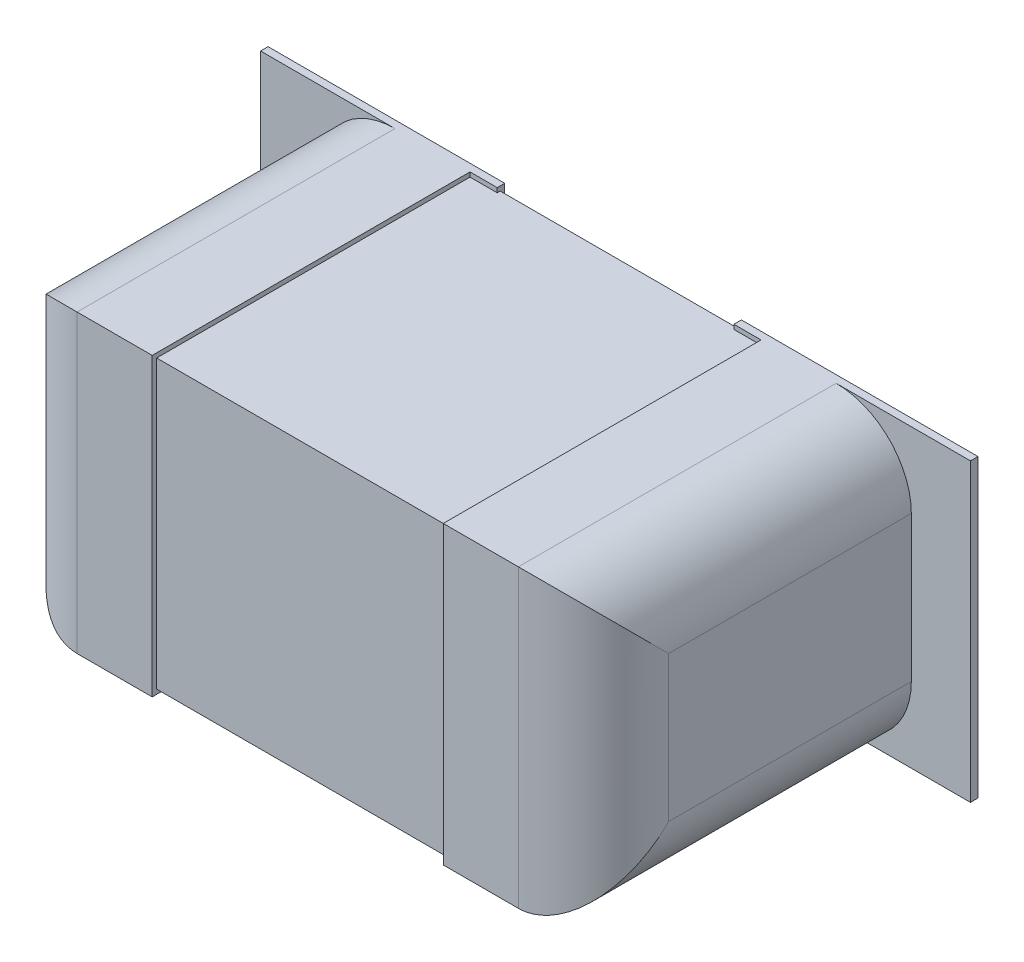
ISO-10303-21;
HEADER;
FILE_DESCRIPTION(('STEP AP214'),'2;1');
FILE_NAME('part.step','',(''),(''),'','','');
FILE_SCHEMA(('AUTOMOTIVE_DESIGN { 1 0 10303 214 1 1 1 1 }'));
ENDSEC;
DATA;
#1=APPLICATION_CONTEXT('core data for automotive mechanical design processes');
#2=APPLICATION_PROTOCOL_DEFINITION('international standard','automotive_design',2000,#1);
#3=PRODUCT_CONTEXT('',#1,'mechanical');
#4=PRODUCT('Part','Part','',(#3));
#5=PRODUCT_RELATED_PRODUCT_CATEGORY('part','',(#4));
#6=PRODUCT_DEFINITION_FORMATION('','',#4);
#7=PRODUCT_DEFINITION_CONTEXT('part definition',#1,'design');
#8=PRODUCT_DEFINITION('design','',#6,#7);
#9=PRODUCT_DEFINITION_SHAPE('','',#8);
#10=(LENGTH_UNIT() NAMED_UNIT(*) SI_UNIT(.MILLI.,.METRE.));
#11=(NAMED_UNIT(*) PLANE_ANGLE_UNIT() SI_UNIT($,.RADIAN.));
#12=(NAMED_UNIT(*) SI_UNIT($,.STERADIAN.) SOLID_ANGLE_UNIT());
#13=UNCERTAINTY_MEASURE_WITH_UNIT(LENGTH_MEASURE(1.E-05),#10,'distance_accuracy_value','');
#14=(GEOMETRIC_REPRESENTATION_CONTEXT(3) GLOBAL_UNCERTAINTY_ASSIGNED_CONTEXT((#13)) GLOBAL_UNIT_ASSIGNED_CONTEXT((#10,
#11,#12)) REPRESENTATION_CONTEXT('',''));
#15=CARTESIAN_POINT('',(0.,0.,0.));
#16=DIRECTION('',(0.,0.,1.));
#17=DIRECTION('',(1.,0.,0.));
#18=AXIS2_PLACEMENT_3D('',#15,#16,#17);
#19=CARTESIAN_POINT('',(0.500000000000032,-0.249999999999991,0.0762));
#20=DIRECTION('',(1.,0.,0.));
#21=DIRECTION('',(0.,0.,-1.));
#22=AXIS2_PLACEMENT_3D('',#19,#20,#21);
#23=PLANE('',#22);
#24=DIRECTION('',(0.,0.,-1.));
#25=VECTOR('',#24,1.);
#26=CARTESIAN_POINT('',(0.500000000000032,-0.122999999999991,0.62831867529435));
#27=LINE('',#26,#25);
#28=CARTESIAN_POINT('',(0.500000000000032,-0.122999999999991,0.0889));
#29=VERTEX_POINT('',#28);
#30=CARTESIAN_POINT('',(0.500000000000032,-0.122999999999991,0.49911));
#31=VERTEX_POINT('',#30);
#32=EDGE_CURVE('E325',#29,#31,#27,.F.);
#33=ORIENTED_EDGE('',*,*,#32,.F.);
#34=DIRECTION('',(0.,1.,0.));
#35=VECTOR('',#34,1.);
#36=CARTESIAN_POINT('',(0.500000000000032,0.,0.0889));
#37=LINE('',#36,#35);
#38=CARTESIAN_POINT('',(0.500000000000032,0.122999999999991,0.0889));
#39=VERTEX_POINT('',#38);
#40=EDGE_CURVE('E238',#39,#29,#37,.F.);
#41=ORIENTED_EDGE('',*,*,#40,.F.);
#42=DIRECTION('',(0.,0.,-1.));
#43=VECTOR('',#42,1.);
#44=CARTESIAN_POINT('',(0.500000000000032,0.122999999999991,0.62831867529435));
#45=LINE('',#44,#43);
#46=CARTESIAN_POINT('',(0.500000000000032,0.122999999999991,0.49911));
#47=VERTEX_POINT('',#46);
#48=EDGE_CURVE('E227',#47,#39,#45,.T.);
#49=ORIENTED_EDGE('',*,*,#48,.F.);
#50=DIRECTION('',(0.,1.,0.));
#51=VECTOR('',#50,1.);
#52=CARTESIAN_POINT('',(0.500000000000032,-0.252128560001866,0.49911));
#53=LINE('',#52,#51);
#54=EDGE_CURVE('E224',#31,#47,#53,.T.);
#55=ORIENTED_EDGE('',*,*,#54,.F.);
#56=EDGE_LOOP('',(#33,#41,#49,#55));
#57=FACE_BOUND('',#56,.T.);
#58=ADVANCED_FACE('F17',(#57),#23,.T.);
#59=CARTESIAN_POINT('',(-0.500000000000032,0.249999999999991,0.0762));
#60=DIRECTION('',(-1.,0.,0.));
#61=DIRECTION('',(0.,0.,1.));
#62=AXIS2_PLACEMENT_3D('',#59,#60,#61);
#63=PLANE('',#62);
#64=DIRECTION('',(0.,0.,-1.));
#65=VECTOR('',#64,1.);
#66=CARTESIAN_POINT('',(-0.500000000000032,0.122999999999991,0.62831867529435));
#67=LINE('',#66,#65);
#68=CARTESIAN_POINT('',(-0.500000000000032,0.122999999999991,0.0889));
#69=VERTEX_POINT('',#68);
#70=CARTESIAN_POINT('',(-0.500000000000032,0.122999999999991,0.49911));
#71=VERTEX_POINT('',#70);
#72=EDGE_CURVE('E309',#69,#71,#67,.F.);
#73=ORIENTED_EDGE('',*,*,#72,.F.);
#74=DIRECTION('',(0.,1.,0.));
#75=VECTOR('',#74,1.);
#76=CARTESIAN_POINT('',(-0.500000000000032,0.,0.0889));
#77=LINE('',#76,#75);
#78=CARTESIAN_POINT('',(-0.500000000000032,-0.122999999999991,0.0889));
#79=VERTEX_POINT('',#78);
#80=EDGE_CURVE('E313',#79,#69,#77,.T.);
#81=ORIENTED_EDGE('',*,*,#80,.F.);
#82=DIRECTION('',(0.,0.,-1.));
#83=VECTOR('',#82,1.);
#84=CARTESIAN_POINT('',(-0.500000000000032,-0.122999999999991,0.62831867529435));
#85=LINE('',#84,#83);
#86=CARTESIAN_POINT('',(-0.500000000000032,-0.122999999999991,0.49911));
#87=VERTEX_POINT('',#86);
#88=EDGE_CURVE('E316',#87,#79,#85,.T.);
#89=ORIENTED_EDGE('',*,*,#88,.F.);
#90=DIRECTION('',(0.,-1.,0.));
#91=VECTOR('',#90,1.);
#92=CARTESIAN_POINT('',(-0.500000000000032,0.252170396105977,0.49911));
#93=LINE('',#92,#91);
#94=EDGE_CURVE('E243',#71,#87,#93,.T.);
#95=ORIENTED_EDGE('',*,*,#94,.F.);
#96=EDGE_LOOP('',(#73,#81,#89,#95));
#97=FACE_BOUND('',#96,.T.);
#98=ADVANCED_FACE('F356',(#97),#63,.T.);
#99=CARTESIAN_POINT('',(-0.373000000000032,0.252170396105977,0.49911));
#100=DIRECTION('',(0.,-1.,0.));
#101=DIRECTION('',(0.,0.,-1.));
#102=AXIS2_PLACEMENT_3D('',#99,#100,#101);
#103=CYLINDRICAL_SURFACE('',#102,0.127);
#104=CARTESIAN_POINT('',(-0.373000000000032,-0.122999999999991,0.49911));
#105=DIRECTION('',(0.,-0.707106781186547,-0.707106781186547));
#106=DIRECTION('',(0.,0.707106781186547,-0.707106781186547));
#107=AXIS2_PLACEMENT_3D('',#104,#105,#106);
#108=ELLIPSE('',#107,0.179605122421383,0.127);
#109=CARTESIAN_POINT('',(-0.373000000000032,-0.249999999999991,0.62611));
#110=VERTEX_POINT('',#109);
#111=EDGE_CURVE('E317',#110,#87,#108,.T.);
#112=ORIENTED_EDGE('',*,*,#111,.F.);
#113=DIRECTION('',(0.,1.,0.));
#114=VECTOR('',#113,1.);
#115=CARTESIAN_POINT('',(-0.373000000000032,0.,0.62611));
#116=LINE('',#115,#114);
#117=CARTESIAN_POINT('',(-0.373000000000032,0.249999999999991,0.62611));
#118=VERTEX_POINT('',#117);
#119=EDGE_CURVE('E208',#118,#110,#116,.F.);
#120=ORIENTED_EDGE('',*,*,#119,.F.);
#121=CARTESIAN_POINT('',(-0.373000000000032,0.122999999999991,0.49911));
#122=DIRECTION('',(0.,0.707106781186547,-0.707106781186547));
#123=DIRECTION('',(0.,-0.707106781186547,-0.707106781186547));
#124=AXIS2_PLACEMENT_3D('',#121,#122,#123);
#125=ELLIPSE('',#124,0.179605122421383,0.127);
#126=EDGE_CURVE('E307',#71,#118,#125,.T.);
#127=ORIENTED_EDGE('',*,*,#126,.F.);
#128=ORIENTED_EDGE('',*,*,#94,.T.);
#129=EDGE_LOOP('',(#112,#120,#127,#128));
#130=FACE_BOUND('',#129,.T.);
#131=ADVANCED_FACE('F361',(#130),#103,.T.);
#132=CARTESIAN_POINT('',(0.373000000000032,-0.252128560001866,0.49911));
#133=DIRECTION('',(0.,1.,0.));
#134=DIRECTION('',(0.,0.,1.));
#135=AXIS2_PLACEMENT_3D('',#132,#133,#134);
#136=CYLINDRICAL_SURFACE('',#135,0.127);
#137=CARTESIAN_POINT('',(0.373000000000032,-0.122999999999991,0.49911));
#138=DIRECTION('',(0.,-0.707106781186547,-0.707106781186547));
#139=DIRECTION('',(0.,0.707106781186547,-0.707106781186547));
#140=AXIS2_PLACEMENT_3D('',#137,#138,#139);
#141=ELLIPSE('',#140,0.179605122421383,0.127);
#142=CARTESIAN_POINT('',(0.373000000000032,-0.249999999999991,0.62611));
#143=VERTEX_POINT('',#142);
#144=EDGE_CURVE('E323',#31,#143,#141,.T.);
#145=ORIENTED_EDGE('',*,*,#144,.F.);
#146=ORIENTED_EDGE('',*,*,#54,.T.);
#147=CARTESIAN_POINT('',(0.373000000000032,0.122999999999991,0.49911));
#148=DIRECTION('',(0.,0.707106781186547,-0.707106781186547));
#149=DIRECTION('',(0.,-0.707106781186547,-0.707106781186547));
#150=AXIS2_PLACEMENT_3D('',#147,#148,#149);
#151=ELLIPSE('',#150,0.179605122421383,0.127);
#152=CARTESIAN_POINT('',(0.373000000000032,0.249999999999991,0.62611));
#153=VERTEX_POINT('',#152);
#154=EDGE_CURVE('E20',#153,#47,#151,.T.);
#155=ORIENTED_EDGE('',*,*,#154,.F.);
#156=DIRECTION('',(0.,1.,0.));
#157=VECTOR('',#156,1.);
#158=CARTESIAN_POINT('',(0.373000000000032,0.,0.62611));
#159=LINE('',#158,#157);
#160=EDGE_CURVE('E198',#143,#153,#159,.T.);
#161=ORIENTED_EDGE('',*,*,#160,.F.);
#162=EDGE_LOOP('',(#145,#146,#155,#161));
#163=FACE_BOUND('',#162,.T.);
#164=ADVANCED_FACE('F222',(#163),#136,.T.);
#165=CARTESIAN_POINT('',(0.373000000000032,0.122999999999991,0.62831867529435));
#166=DIRECTION('',(0.,0.,-1.));
#167=DIRECTION('',(-1.,0.,0.));
#168=AXIS2_PLACEMENT_3D('',#165,#166,#167);
#169=CYLINDRICAL_SURFACE('',#168,0.127);
#170=ORIENTED_EDGE('',*,*,#48,.T.);
#171=CARTESIAN_POINT('',(0.373000000000032,0.122999999999991,0.0888999999999999));
#172=DIRECTION('',(0.,0.,-1.));
#173=DIRECTION('',(-1.,0.,0.));
#174=AXIS2_PLACEMENT_3D('',#171,#172,#173);
#175=CIRCLE('',#174,0.127);
#176=CARTESIAN_POINT('',(0.372860566844937,0.249999999999991,0.0889000180949765));
#177=VERTEX_POINT('',#176);
#178=EDGE_CURVE('E230',#177,#39,#175,.T.);
#179=ORIENTED_EDGE('',*,*,#178,.F.);
#180=DIRECTION('',(-0.000259550557687787,0.,-0.999999966316753));
#181=VECTOR('',#180,1.);
#182=CARTESIAN_POINT('',(0.373000000000032,0.249999999999991,0.62611));
#183=LINE('',#182,#181);
#184=EDGE_CURVE('E215',#153,#177,#183,.T.);
#185=ORIENTED_EDGE('',*,*,#184,.F.);
#186=ORIENTED_EDGE('',*,*,#154,.T.);
#187=EDGE_LOOP('',(#170,#179,#185,#186));
#188=FACE_BOUND('',#187,.T.);
#189=ADVANCED_FACE('F228',(#188),#169,.T.);
#190=CARTESIAN_POINT('',(0.5999988,-0.2500122,0.0762));
#191=DIRECTION('',(1.,0.,0.));
#192=DIRECTION('',(0.,0.,-1.));
#193=AXIS2_PLACEMENT_3D('',#190,#191,#192);
#194=PLANE('',#193);
#195=DIRECTION('',(0.,0.,-1.));
#196=VECTOR('',#195,1.);
#197=CARTESIAN_POINT('',(0.5999988,-0.249999999999991,0.0762));
#198=LINE('',#197,#196);
#199=CARTESIAN_POINT('',(0.5999988,-0.249999999999991,0.0762));
#200=VERTEX_POINT('',#199);
#201=CARTESIAN_POINT('',(0.5999988,-0.249999999999991,0.0889));
#202=VERTEX_POINT('',#201);
#203=EDGE_CURVE('E295',#200,#202,#198,.F.);
#204=ORIENTED_EDGE('',*,*,#203,.F.);
#205=DIRECTION('',(0.,1.,0.));
#206=VECTOR('',#205,1.);
#207=CARTESIAN_POINT('',(0.5999988,0.,0.0762));
#208=LINE('',#207,#206);
#209=CARTESIAN_POINT('',(0.5999988,0.249999999999991,0.0762));
#210=VERTEX_POINT('',#209);
#211=EDGE_CURVE('E298',#200,#210,#208,.T.);
#212=ORIENTED_EDGE('',*,*,#211,.T.);
#213=DIRECTION('',(0.,0.,1.));
#214=VECTOR('',#213,1.);
#215=CARTESIAN_POINT('',(0.5999988,0.249999999999991,0.0762));
#216=LINE('',#215,#214);
#217=CARTESIAN_POINT('',(0.5999988,0.249999999999991,0.0889));
#218=VERTEX_POINT('',#217);
#219=EDGE_CURVE('E234',#218,#210,#216,.F.);
#220=ORIENTED_EDGE('',*,*,#219,.F.);
#221=DIRECTION('',(0.,1.,0.));
#222=VECTOR('',#221,1.);
#223=CARTESIAN_POINT('',(0.5999988,0.,0.0889));
#224=LINE('',#223,#222);
#225=EDGE_CURVE('E241',#202,#218,#224,.T.);
#226=ORIENTED_EDGE('',*,*,#225,.F.);
#227=EDGE_LOOP('',(#204,#212,#220,#226));
#228=FACE_BOUND('',#227,.T.);
#229=ADVANCED_FACE('F336',(#228),#194,.T.);
#230=CARTESIAN_POINT('',(0.,0.,0.0889));
#231=DIRECTION('',(0.,0.,1.));
#232=DIRECTION('',(1.,0.,0.));
#233=AXIS2_PLACEMENT_3D('',#230,#231,#232);
#234=PLANE('',#233);
#235=ORIENTED_EDGE('',*,*,#178,.T.);
#236=ORIENTED_EDGE('',*,*,#40,.T.);
#237=CARTESIAN_POINT('',(0.373000000000032,-0.122999999999991,0.0888999999999999));
#238=DIRECTION('',(0.,0.,-1.));
#239=DIRECTION('',(-1.,0.,0.));
#240=AXIS2_PLACEMENT_3D('',#237,#238,#239);
#241=CIRCLE('',#240,0.127);
#242=CARTESIAN_POINT('',(0.372860566844937,-0.249999999999991,0.0889000180949766));
#243=VERTEX_POINT('',#242);
#244=EDGE_CURVE('E320',#243,#29,#241,.F.);
#245=ORIENTED_EDGE('',*,*,#244,.F.);
#246=DIRECTION('',(1.,0.,0.));
#247=VECTOR('',#246,1.);
#248=CARTESIAN_POINT('',(-0.500000000000032,-0.249999999999991,0.0889));
#249=LINE('',#248,#247);
#250=EDGE_CURVE('E297',#202,#243,#249,.F.);
#251=ORIENTED_EDGE('',*,*,#250,.F.);
#252=ORIENTED_EDGE('',*,*,#225,.T.);
#253=DIRECTION('',(1.,0.,0.));
#254=VECTOR('',#253,1.);
#255=CARTESIAN_POINT('',(0.500000000000032,0.249999999999991,0.0889));
#256=LINE('',#255,#254);
#257=EDGE_CURVE('E232',#177,#218,#256,.T.);
#258=ORIENTED_EDGE('',*,*,#257,.F.);
#259=EDGE_LOOP('',(#235,#236,#245,#251,#252,#258));
#260=FACE_BOUND('',#259,.T.);
#261=ADVANCED_FACE('F329',(#260),#234,.T.);
#262=CARTESIAN_POINT('',(0.373000000000032,-0.122999999999991,0.62831867529435));
#263=DIRECTION('',(0.,0.,-1.));
#264=DIRECTION('',(-1.,0.,0.));
#265=AXIS2_PLACEMENT_3D('',#262,#263,#264);
#266=CYLINDRICAL_SURFACE('',#265,0.127);
#267=DIRECTION('',(0.000259550557687787,0.,0.999999966316753));
#268=VECTOR('',#267,1.);
#269=CARTESIAN_POINT('',(0.37286056684024,-0.249999999999991,0.0889));
#270=LINE('',#269,#268);
#271=EDGE_CURVE('E343',#243,#143,#270,.T.);
#272=ORIENTED_EDGE('',*,*,#271,.F.);
#273=ORIENTED_EDGE('',*,*,#244,.T.);
#274=ORIENTED_EDGE('',*,*,#32,.T.);
#275=ORIENTED_EDGE('',*,*,#144,.T.);
#276=EDGE_LOOP('',(#272,#273,#274,#275));
#277=FACE_BOUND('',#276,.T.);
#278=ADVANCED_FACE('F353',(#277),#266,.T.);
#279=CARTESIAN_POINT('',(-0.373000000000032,-0.122999999999991,0.62831867529435));
#280=DIRECTION('',(0.,0.,-1.));
#281=DIRECTION('',(-1.,0.,0.));
#282=AXIS2_PLACEMENT_3D('',#279,#280,#281);
#283=CYLINDRICAL_SURFACE('',#282,0.127);
#284=ORIENTED_EDGE('',*,*,#88,.T.);
#285=CARTESIAN_POINT('',(-0.373000000000032,-0.122999999999991,0.0888999999999999));
#286=DIRECTION('',(0.,0.,-1.));
#287=DIRECTION('',(-1.,0.,0.));
#288=AXIS2_PLACEMENT_3D('',#285,#286,#287);
#289=CIRCLE('',#288,0.127);
#290=CARTESIAN_POINT('',(-0.372860566844937,-0.249999999999991,0.0889000180949765));
#291=VERTEX_POINT('',#290);
#292=EDGE_CURVE('E310',#291,#79,#289,.T.);
#293=ORIENTED_EDGE('',*,*,#292,.F.);
#294=DIRECTION('',(0.000259550557687787,0.,-0.999999966316753));
#295=VECTOR('',#294,1.);
#296=CARTESIAN_POINT('',(-0.373000000000032,-0.249999999999991,0.62611));
#297=LINE('',#296,#295);
#298=EDGE_CURVE('E290',#110,#291,#297,.T.);
#299=ORIENTED_EDGE('',*,*,#298,.F.);
#300=ORIENTED_EDGE('',*,*,#111,.T.);
#301=EDGE_LOOP('',(#284,#293,#299,#300));
#302=FACE_BOUND('',#301,.T.);
#303=ADVANCED_FACE('F450',(#302),#283,.T.);
#304=CARTESIAN_POINT('',(-0.5999988,0.2500122,0.0762));
#305=DIRECTION('',(-1.,0.,0.));
#306=DIRECTION('',(0.,0.,1.));
#307=AXIS2_PLACEMENT_3D('',#304,#305,#306);
#308=PLANE('',#307);
#309=DIRECTION('',(0.,0.,1.));
#310=VECTOR('',#309,1.);
#311=CARTESIAN_POINT('',(-0.5999988,0.249999999999991,0.0762));
#312=LINE('',#311,#310);
#313=CARTESIAN_POINT('',(-0.5999988,0.249999999999991,0.0762));
#314=VERTEX_POINT('',#313);
#315=CARTESIAN_POINT('',(-0.5999988,0.249999999999991,0.0889));
#316=VERTEX_POINT('',#315);
#317=EDGE_CURVE('E278',#314,#316,#312,.T.);
#318=ORIENTED_EDGE('',*,*,#317,.F.);
#319=DIRECTION('',(0.,1.,0.));
#320=VECTOR('',#319,1.);
#321=CARTESIAN_POINT('',(-0.5999988,0.,0.0762));
#322=LINE('',#321,#320);
#323=CARTESIAN_POINT('',(-0.5999988,-0.249999999999991,0.0762));
#324=VERTEX_POINT('',#323);
#325=EDGE_CURVE('E281',#314,#324,#322,.F.);
#326=ORIENTED_EDGE('',*,*,#325,.T.);
#327=DIRECTION('',(0.,0.,-1.));
#328=VECTOR('',#327,1.);
#329=CARTESIAN_POINT('',(-0.5999988,-0.249999999999991,0.0762));
#330=LINE('',#329,#328);
#331=CARTESIAN_POINT('',(-0.5999988,-0.249999999999991,0.0889));
#332=VERTEX_POINT('',#331);
#333=EDGE_CURVE('E285',#332,#324,#330,.T.);
#334=ORIENTED_EDGE('',*,*,#333,.F.);
#335=DIRECTION('',(0.,1.,0.));
#336=VECTOR('',#335,1.);
#337=CARTESIAN_POINT('',(-0.5999988,0.,0.0889));
#338=LINE('',#337,#336);
#339=EDGE_CURVE('E314',#316,#332,#338,.F.);
#340=ORIENTED_EDGE('',*,*,#339,.F.);
#341=EDGE_LOOP('',(#318,#326,#334,#340));
#342=FACE_BOUND('',#341,.T.);
#343=ADVANCED_FACE('F446',(#342),#308,.T.);
#344=CARTESIAN_POINT('',(0.,0.,0.0889));
#345=DIRECTION('',(0.,0.,1.));
#346=DIRECTION('',(1.,0.,0.));
#347=AXIS2_PLACEMENT_3D('',#344,#345,#346);
#348=PLANE('',#347);
#349=ORIENTED_EDGE('',*,*,#292,.T.);
#350=ORIENTED_EDGE('',*,*,#80,.T.);
#351=CARTESIAN_POINT('',(-0.373000000000032,0.122999999999991,0.0888999999999999));
#352=DIRECTION('',(0.,0.,-1.));
#353=DIRECTION('',(-1.,0.,0.));
#354=AXIS2_PLACEMENT_3D('',#351,#352,#353);
#355=CIRCLE('',#354,0.127);
#356=CARTESIAN_POINT('',(-0.372860566844937,0.249999999999991,0.0889000180949766));
#357=VERTEX_POINT('',#356);
#358=EDGE_CURVE('E304',#357,#69,#355,.F.);
#359=ORIENTED_EDGE('',*,*,#358,.F.);
#360=DIRECTION('',(1.,0.,0.));
#361=VECTOR('',#360,1.);
#362=CARTESIAN_POINT('',(0.500000000000032,0.249999999999991,0.0889));
#363=LINE('',#362,#361);
#364=EDGE_CURVE('E280',#316,#357,#363,.T.);
#365=ORIENTED_EDGE('',*,*,#364,.F.);
#366=ORIENTED_EDGE('',*,*,#339,.T.);
#367=DIRECTION('',(1.,0.,0.));
#368=VECTOR('',#367,1.);
#369=CARTESIAN_POINT('',(-0.500000000000032,-0.249999999999991,0.0889));
#370=LINE('',#369,#368);
#371=EDGE_CURVE('E287',#291,#332,#370,.F.);
#372=ORIENTED_EDGE('',*,*,#371,.F.);
#373=EDGE_LOOP('',(#349,#350,#359,#365,#366,#372));
#374=FACE_BOUND('',#373,.T.);
#375=ADVANCED_FACE('F442',(#374),#348,.T.);
#376=CARTESIAN_POINT('',(-0.373000000000032,0.122999999999991,0.62831867529435));
#377=DIRECTION('',(0.,0.,-1.));
#378=DIRECTION('',(-1.,0.,0.));
#379=AXIS2_PLACEMENT_3D('',#376,#377,#378);
#380=CYLINDRICAL_SURFACE('',#379,0.127);
#381=DIRECTION('',(-0.000259550557687787,0.,0.999999966316753));
#382=VECTOR('',#381,1.);
#383=CARTESIAN_POINT('',(-0.37286056684024,0.249999999999991,0.0889));
#384=LINE('',#383,#382);
#385=EDGE_CURVE('E483',#357,#118,#384,.T.);
#386=ORIENTED_EDGE('',*,*,#385,.F.);
#387=ORIENTED_EDGE('',*,*,#358,.T.);
#388=ORIENTED_EDGE('',*,*,#72,.T.);
#389=ORIENTED_EDGE('',*,*,#126,.T.);
#390=EDGE_LOOP('',(#386,#387,#388,#389));
#391=FACE_BOUND('',#390,.T.);
#392=ADVANCED_FACE('F438',(#391),#380,.T.);
#393=CARTESIAN_POINT('',(0.,0.,0.62611));
#394=DIRECTION('',(0.,0.,1.));
#395=DIRECTION('',(1.,0.,0.));
#396=AXIS2_PLACEMENT_3D('',#393,#394,#395);
#397=PLANE('',#396);
#398=DIRECTION('',(1.,0.,0.));
#399=VECTOR('',#398,1.);
#400=CARTESIAN_POINT('',(0.500000000000032,0.249999999999991,0.62611));
#401=LINE('',#400,#399);
#402=CARTESIAN_POINT('',(-0.246000000000007,0.249999999999991,0.62611));
#403=VERTEX_POINT('',#402);
#404=EDGE_CURVE('E277',#118,#403,#401,.T.);
#405=ORIENTED_EDGE('',*,*,#404,.F.);
#406=ORIENTED_EDGE('',*,*,#119,.T.);
#407=DIRECTION('',(1.,0.,0.));
#408=VECTOR('',#407,1.);
#409=CARTESIAN_POINT('',(-0.500000000000032,-0.249999999999991,0.62611));
#410=LINE('',#409,#408);
#411=CARTESIAN_POINT('',(-0.246000000000007,-0.250002711111104,0.62611));
#412=VERTEX_POINT('',#411);
#413=EDGE_CURVE('E294',#412,#110,#410,.F.);
#414=ORIENTED_EDGE('',*,*,#413,.F.);
#415=DIRECTION('',(0.,1.,0.));
#416=VECTOR('',#415,1.);
#417=CARTESIAN_POINT('',(-0.246000000000007,-0.249999999999991,0.62611));
#418=LINE('',#417,#416);
#419=EDGE_CURVE('E514',#412,#403,#418,.T.);
#420=ORIENTED_EDGE('',*,*,#419,.T.);
#421=EDGE_LOOP('',(#405,#406,#414,#420));
#422=FACE_BOUND('',#421,.T.);
#423=ADVANCED_FACE('F435',(#422),#397,.T.);
#424=CARTESIAN_POINT('',(0.,0.,0.62611));
#425=DIRECTION('',(0.,0.,1.));
#426=DIRECTION('',(1.,0.,0.));
#427=AXIS2_PLACEMENT_3D('',#424,#425,#426);
#428=PLANE('',#427);
#429=DIRECTION('',(1.,0.,0.));
#430=VECTOR('',#429,1.);
#431=CARTESIAN_POINT('',(-0.500000000000032,-0.249999999999991,0.62611));
#432=LINE('',#431,#430);
#433=CARTESIAN_POINT('',(0.246000000000007,-0.249999999999991,0.62611));
#434=VERTEX_POINT('',#433);
#435=EDGE_CURVE('E204',#143,#434,#432,.F.);
#436=ORIENTED_EDGE('',*,*,#435,.F.);
#437=ORIENTED_EDGE('',*,*,#160,.T.);
#438=DIRECTION('',(1.,0.,0.));
#439=VECTOR('',#438,1.);
#440=CARTESIAN_POINT('',(0.500000000000032,0.249999999999991,0.62611));
#441=LINE('',#440,#439);
#442=CARTESIAN_POINT('',(0.246000000000007,0.250002711111104,0.62611));
#443=VERTEX_POINT('',#442);
#444=EDGE_CURVE('E202',#443,#153,#441,.T.);
#445=ORIENTED_EDGE('',*,*,#444,.F.);
#446=DIRECTION('',(0.,1.,0.));
#447=VECTOR('',#446,1.);
#448=CARTESIAN_POINT('',(0.246000000000007,-0.249999999999991,0.62611));
#449=LINE('',#448,#447);
#450=EDGE_CURVE('E569',#443,#434,#449,.F.);
#451=ORIENTED_EDGE('',*,*,#450,.T.);
#452=EDGE_LOOP('',(#436,#437,#445,#451));
#453=FACE_BOUND('',#452,.T.);
#454=ADVANCED_FACE('F200',(#453),#428,.T.);
#455=CARTESIAN_POINT('',(0.,0.,0.0889));
#456=DIRECTION('',(0.,0.,1.));
#457=DIRECTION('',(1.,0.,0.));
#458=AXIS2_PLACEMENT_3D('',#455,#456,#457);
#459=PLANE('',#458);
#460=DIRECTION('',(1.,0.,0.));
#461=VECTOR('',#460,1.);
#462=CARTESIAN_POINT('',(-0.246000000000007,0.242379999999991,0.0889));
#463=LINE('',#462,#461);
#464=CARTESIAN_POINT('',(0.1999996,0.242379999999991,0.0889));
#465=VERTEX_POINT('',#464);
#466=CARTESIAN_POINT('',(0.246000000000007,0.242379999999991,0.0889));
#467=VERTEX_POINT('',#466);
#468=EDGE_CURVE('E530',#465,#467,#463,.T.);
#469=ORIENTED_EDGE('',*,*,#468,.T.);
#470=DIRECTION('',(0.,1.,0.));
#471=VECTOR('',#470,1.);
#472=CARTESIAN_POINT('',(0.246000000000007,-0.249999999999991,0.0889));
#473=LINE('',#472,#471);
#474=CARTESIAN_POINT('',(0.246000000000007,0.250002033333325,0.0889));
#475=VERTEX_POINT('',#474);
#476=EDGE_CURVE('E559',#467,#475,#473,.T.);
#477=ORIENTED_EDGE('',*,*,#476,.T.);
#478=DIRECTION('',(1.,0.,0.));
#479=VECTOR('',#478,1.);
#480=CARTESIAN_POINT('',(0.500000000000032,0.249999999999991,0.0889));
#481=LINE('',#480,#479);
#482=CARTESIAN_POINT('',(0.1999996,0.249999999999991,0.0889));
#483=VERTEX_POINT('',#482);
#484=EDGE_CURVE('E302',#483,#475,#481,.T.);
#485=ORIENTED_EDGE('',*,*,#484,.F.);
#486=DIRECTION('',(0.,1.,0.));
#487=VECTOR('',#486,1.);
#488=CARTESIAN_POINT('',(0.1999996,0.2500122,0.0889));
#489=LINE('',#488,#487);
#490=EDGE_CURVE('E258',#465,#483,#489,.T.);
#491=ORIENTED_EDGE('',*,*,#490,.F.);
#492=EDGE_LOOP('',(#469,#477,#485,#491));
#493=FACE_BOUND('',#492,.T.);
#494=ADVANCED_FACE('F429',(#493),#459,.T.);
#495=CARTESIAN_POINT('',(0.500000000000032,0.249999999999991,0.0762));
#496=DIRECTION('',(0.,1.,0.));
#497=DIRECTION('',(0.,0.,1.));
#498=AXIS2_PLACEMENT_3D('',#495,#496,#497);
#499=PLANE('',#498);
#500=ORIENTED_EDGE('',*,*,#484,.T.);
#501=DIRECTION('',(0.,0.,-1.));
#502=VECTOR('',#501,1.);
#503=CARTESIAN_POINT('',(0.246000000000007,0.25000406666666,0.08382));
#504=LINE('',#503,#502);
#505=EDGE_CURVE('E218',#475,#443,#504,.F.);
#506=ORIENTED_EDGE('',*,*,#505,.T.);
#507=ORIENTED_EDGE('',*,*,#444,.T.);
#508=ORIENTED_EDGE('',*,*,#184,.T.);
#509=ORIENTED_EDGE('',*,*,#257,.T.);
#510=ORIENTED_EDGE('',*,*,#219,.T.);
#511=DIRECTION('',(1.,0.,0.));
#512=VECTOR('',#511,1.);
#513=CARTESIAN_POINT('',(0.500000000000032,0.249999999999991,0.0762));
#514=LINE('',#513,#512);
#515=CARTESIAN_POINT('',(0.1999996,0.249999999999991,0.0762));
#516=VERTEX_POINT('',#515);
#517=EDGE_CURVE('E299',#210,#516,#514,.F.);
#518=ORIENTED_EDGE('',*,*,#517,.T.);
#519=DIRECTION('',(0.,0.,-1.));
#520=VECTOR('',#519,1.);
#521=CARTESIAN_POINT('',(0.1999996,0.249999999999991,0.0762));
#522=LINE('',#521,#520);
#523=EDGE_CURVE('E256',#483,#516,#522,.T.);
#524=ORIENTED_EDGE('',*,*,#523,.F.);
#525=EDGE_LOOP('',(#500,#506,#507,#508,#509,#510,#518,#524));
#526=FACE_BOUND('',#525,.T.);
#527=ADVANCED_FACE('F212',(#526),#499,.T.);
#528=CARTESIAN_POINT('',(0.,0.,0.0762));
#529=DIRECTION('',(0.,0.,1.));
#530=DIRECTION('',(1.,0.,0.));
#531=AXIS2_PLACEMENT_3D('',#528,#529,#530);
#532=PLANE('',#531);
#533=DIRECTION('',(1.,0.,0.));
#534=VECTOR('',#533,1.);
#535=CARTESIAN_POINT('',(-0.500000000000032,-0.249999999999991,0.0762));
#536=LINE('',#535,#534);
#537=CARTESIAN_POINT('',(0.1999996,-0.249999999999991,0.0762));
#538=VERTEX_POINT('',#537);
#539=EDGE_CURVE('E291',#538,#200,#536,.T.);
#540=ORIENTED_EDGE('',*,*,#539,.F.);
#541=DIRECTION('',(0.,1.,0.));
#542=VECTOR('',#541,1.);
#543=CARTESIAN_POINT('',(0.1999996,0.2500122,0.0762));
#544=LINE('',#543,#542);
#545=EDGE_CURVE('E255',#516,#538,#544,.F.);
#546=ORIENTED_EDGE('',*,*,#545,.F.);
#547=ORIENTED_EDGE('',*,*,#517,.F.);
#548=ORIENTED_EDGE('',*,*,#211,.F.);
#549=EDGE_LOOP('',(#540,#546,#547,#548));
#550=FACE_BOUND('',#549,.T.);
#551=ADVANCED_FACE('F424',(#550),#532,.F.);
#552=CARTESIAN_POINT('',(-0.500000000000032,-0.249999999999991,0.0762));
#553=DIRECTION('',(0.,-1.,0.));
#554=DIRECTION('',(0.,0.,-1.));
#555=AXIS2_PLACEMENT_3D('',#552,#553,#554);
#556=PLANE('',#555);
#557=DIRECTION('',(0.,0.,1.));
#558=VECTOR('',#557,1.);
#559=CARTESIAN_POINT('',(0.1999996,-0.249999999999991,0.0762));
#560=LINE('',#559,#558);
#561=CARTESIAN_POINT('',(0.1999996,-0.249999999999991,0.0889));
#562=VERTEX_POINT('',#561);
#563=EDGE_CURVE('E252',#538,#562,#560,.T.);
#564=ORIENTED_EDGE('',*,*,#563,.F.);
#565=ORIENTED_EDGE('',*,*,#539,.T.);
#566=ORIENTED_EDGE('',*,*,#203,.T.);
#567=ORIENTED_EDGE('',*,*,#250,.T.);
#568=ORIENTED_EDGE('',*,*,#271,.T.);
#569=ORIENTED_EDGE('',*,*,#435,.T.);
#570=DIRECTION('',(0.,0.,-1.));
#571=VECTOR('',#570,1.);
#572=CARTESIAN_POINT('',(0.246000000000007,-0.249999999999991,0.08382));
#573=LINE('',#572,#571);
#574=CARTESIAN_POINT('',(0.246000000000007,-0.249999999999991,0.0889));
#575=VERTEX_POINT('',#574);
#576=EDGE_CURVE('E265',#434,#575,#573,.T.);
#577=ORIENTED_EDGE('',*,*,#576,.T.);
#578=DIRECTION('',(1.,0.,0.));
#579=VECTOR('',#578,1.);
#580=CARTESIAN_POINT('',(0.,-0.249999999999991,0.0889));
#581=LINE('',#580,#579);
#582=EDGE_CURVE('E259',#562,#575,#581,.T.);
#583=ORIENTED_EDGE('',*,*,#582,.F.);
#584=EDGE_LOOP('',(#564,#565,#566,#567,#568,#569,#577,#583));
#585=FACE_BOUND('',#584,.T.);
#586=ADVANCED_FACE('F348',(#585),#556,.T.);
#587=CARTESIAN_POINT('',(-0.500000000000032,-0.249999999999991,0.0762));
#588=DIRECTION('',(0.,-1.,0.));
#589=DIRECTION('',(0.,0.,-1.));
#590=AXIS2_PLACEMENT_3D('',#587,#588,#589);
#591=PLANE('',#590);
#592=DIRECTION('',(1.,0.,0.));
#593=VECTOR('',#592,1.);
#594=CARTESIAN_POINT('',(0.,-0.25000406666666,0.0889));
#595=LINE('',#594,#593);
#596=CARTESIAN_POINT('',(-0.246000000000007,-0.250003388888882,0.0889));
#597=VERTEX_POINT('',#596);
#598=CARTESIAN_POINT('',(-0.1999996,-0.250002033333325,0.0889));
#599=VERTEX_POINT('',#598);
#600=EDGE_CURVE('E507',#597,#599,#595,.T.);
#601=ORIENTED_EDGE('',*,*,#600,.F.);
#602=DIRECTION('',(0.,0.,1.));
#603=VECTOR('',#602,1.);
#604=CARTESIAN_POINT('',(-0.246000000000007,-0.25000406666666,0.0762));
#605=LINE('',#604,#603);
#606=EDGE_CURVE('E506',#597,#412,#605,.T.);
#607=ORIENTED_EDGE('',*,*,#606,.T.);
#608=ORIENTED_EDGE('',*,*,#413,.T.);
#609=ORIENTED_EDGE('',*,*,#298,.T.);
#610=ORIENTED_EDGE('',*,*,#371,.T.);
#611=ORIENTED_EDGE('',*,*,#333,.T.);
#612=DIRECTION('',(1.,0.,0.));
#613=VECTOR('',#612,1.);
#614=CARTESIAN_POINT('',(-0.500000000000032,-0.249999999999991,0.0762));
#615=LINE('',#614,#613);
#616=CARTESIAN_POINT('',(-0.1999996,-0.249999999999991,0.0762));
#617=VERTEX_POINT('',#616);
#618=EDGE_CURVE('E282',#324,#617,#615,.T.);
#619=ORIENTED_EDGE('',*,*,#618,.T.);
#620=DIRECTION('',(0.,0.,-1.));
#621=VECTOR('',#620,1.);
#622=CARTESIAN_POINT('',(-0.1999996,-0.249999999999991,0.0762));
#623=LINE('',#622,#621);
#624=EDGE_CURVE('E249',#599,#617,#623,.T.);
#625=ORIENTED_EDGE('',*,*,#624,.F.);
#626=EDGE_LOOP('',(#601,#607,#608,#609,#610,#611,#619,#625));
#627=FACE_BOUND('',#626,.T.);
#628=ADVANCED_FACE('F417',(#627),#591,.T.);
#629=CARTESIAN_POINT('',(0.,0.,0.0762));
#630=DIRECTION('',(0.,0.,1.));
#631=DIRECTION('',(1.,0.,0.));
#632=AXIS2_PLACEMENT_3D('',#629,#630,#631);
#633=PLANE('',#632);
#634=DIRECTION('',(1.,0.,0.));
#635=VECTOR('',#634,1.);
#636=CARTESIAN_POINT('',(0.500000000000032,0.249999999999991,0.0762));
#637=LINE('',#636,#635);
#638=CARTESIAN_POINT('',(-0.1999996,0.249999999999991,0.0762));
#639=VERTEX_POINT('',#638);
#640=EDGE_CURVE('E274',#639,#314,#637,.F.);
#641=ORIENTED_EDGE('',*,*,#640,.F.);
#642=DIRECTION('',(0.,1.,0.));
#643=VECTOR('',#642,1.);
#644=CARTESIAN_POINT('',(-0.1999996,-0.2500122,0.0762));
#645=LINE('',#644,#643);
#646=EDGE_CURVE('E248',#617,#639,#645,.T.);
#647=ORIENTED_EDGE('',*,*,#646,.F.);
#648=ORIENTED_EDGE('',*,*,#618,.F.);
#649=ORIENTED_EDGE('',*,*,#325,.F.);
#650=EDGE_LOOP('',(#641,#647,#648,#649));
#651=FACE_BOUND('',#650,.T.);
#652=ADVANCED_FACE('F413',(#651),#633,.F.);
#653=CARTESIAN_POINT('',(0.500000000000032,0.249999999999991,0.0762));
#654=DIRECTION('',(0.,1.,0.));
#655=DIRECTION('',(0.,0.,1.));
#656=AXIS2_PLACEMENT_3D('',#653,#654,#655);
#657=PLANE('',#656);
#658=DIRECTION('',(0.,0.,1.));
#659=VECTOR('',#658,1.);
#660=CARTESIAN_POINT('',(-0.1999996,0.249999999999991,0.0762));
#661=LINE('',#660,#659);
#662=CARTESIAN_POINT('',(-0.1999996,0.249999999999991,0.0889));
#663=VERTEX_POINT('',#662);
#664=EDGE_CURVE('E245',#639,#663,#661,.T.);
#665=ORIENTED_EDGE('',*,*,#664,.F.);
#666=ORIENTED_EDGE('',*,*,#640,.T.);
#667=ORIENTED_EDGE('',*,*,#317,.T.);
#668=ORIENTED_EDGE('',*,*,#364,.T.);
#669=ORIENTED_EDGE('',*,*,#385,.T.);
#670=ORIENTED_EDGE('',*,*,#404,.T.);
#671=DIRECTION('',(0.,0.,1.));
#672=VECTOR('',#671,1.);
#673=CARTESIAN_POINT('',(-0.246000000000007,0.249999999999991,0.0762));
#674=LINE('',#673,#672);
#675=CARTESIAN_POINT('',(-0.246000000000007,0.249999999999991,0.0889));
#676=VERTEX_POINT('',#675);
#677=EDGE_CURVE('E270',#403,#676,#674,.F.);
#678=ORIENTED_EDGE('',*,*,#677,.T.);
#679=DIRECTION('',(-1.,0.,0.));
#680=VECTOR('',#679,1.);
#681=CARTESIAN_POINT('',(0.,0.249999999999991,0.0889));
#682=LINE('',#681,#680);
#683=EDGE_CURVE('E271',#663,#676,#682,.T.);
#684=ORIENTED_EDGE('',*,*,#683,.F.);
#685=EDGE_LOOP('',(#665,#666,#667,#668,#669,#670,#678,#684));
#686=FACE_BOUND('',#685,.T.);
#687=ADVANCED_FACE('F409',(#686),#657,.T.);
#688=CARTESIAN_POINT('',(0.,0.,0.0889));
#689=DIRECTION('',(0.,0.,1.));
#690=DIRECTION('',(1.,0.,0.));
#691=AXIS2_PLACEMENT_3D('',#688,#689,#690);
#692=PLANE('',#691);
#693=DIRECTION('',(0.,1.,0.));
#694=VECTOR('',#693,1.);
#695=CARTESIAN_POINT('',(-0.1999996,-0.2500122,0.0889));
#696=LINE('',#695,#694);
#697=CARTESIAN_POINT('',(-0.1999996,0.242379999999991,0.0889));
#698=VERTEX_POINT('',#697);
#699=EDGE_CURVE('E247',#663,#698,#696,.F.);
#700=ORIENTED_EDGE('',*,*,#699,.F.);
#701=ORIENTED_EDGE('',*,*,#683,.T.);
#702=DIRECTION('',(0.,1.,0.));
#703=VECTOR('',#702,1.);
#704=CARTESIAN_POINT('',(-0.246000000000007,0.,0.0889));
#705=LINE('',#704,#703);
#706=CARTESIAN_POINT('',(-0.246000000000007,0.242379999999991,0.0889));
#707=VERTEX_POINT('',#706);
#708=EDGE_CURVE('E266',#676,#707,#705,.F.);
#709=ORIENTED_EDGE('',*,*,#708,.T.);
#710=DIRECTION('',(1.,0.,0.));
#711=VECTOR('',#710,1.);
#712=CARTESIAN_POINT('',(-0.246000000000007,0.242379999999991,0.0889));
#713=LINE('',#712,#711);
#714=EDGE_CURVE('E273',#707,#698,#713,.T.);
#715=ORIENTED_EDGE('',*,*,#714,.T.);
#716=EDGE_LOOP('',(#700,#701,#709,#715));
#717=FACE_BOUND('',#716,.T.);
#718=ADVANCED_FACE('F405',(#717),#692,.T.);
#719=CARTESIAN_POINT('',(-0.246000000000007,0.242379999999991,0.0762));
#720=DIRECTION('',(0.,-1.,0.));
#721=DIRECTION('',(0.,0.,-1.));
#722=AXIS2_PLACEMENT_3D('',#719,#720,#721);
#723=PLANE('',#722);
#724=DIRECTION('',(-1.,0.,0.));
#725=VECTOR('',#724,1.);
#726=CARTESIAN_POINT('',(-0.246000000000007,0.242379999999991,0.61849));
#727=LINE('',#726,#725);
#728=CARTESIAN_POINT('',(-0.246000000000007,0.242379999999991,0.61849));
#729=VERTEX_POINT('',#728);
#730=CARTESIAN_POINT('',(0.246000000000007,0.242379999999991,0.61849));
#731=VERTEX_POINT('',#730);
#732=EDGE_CURVE('E537',#729,#731,#727,.F.);
#733=ORIENTED_EDGE('',*,*,#732,.T.);
#734=DIRECTION('',(0.,0.,-1.));
#735=VECTOR('',#734,1.);
#736=CARTESIAN_POINT('',(0.246000000000007,0.242379999999991,0.08382));
#737=LINE('',#736,#735);
#738=EDGE_CURVE('E554',#731,#467,#737,.T.);
#739=ORIENTED_EDGE('',*,*,#738,.T.);
#740=ORIENTED_EDGE('',*,*,#468,.F.);
#741=DIRECTION('',(0.,0.,1.));
#742=VECTOR('',#741,1.);
#743=CARTESIAN_POINT('',(0.1999996,0.242379999999991,0.0762));
#744=LINE('',#743,#742);
#745=CARTESIAN_POINT('',(0.1999996,0.242379999999991,0.08382));
#746=VERTEX_POINT('',#745);
#747=EDGE_CURVE('E262',#746,#465,#744,.T.);
#748=ORIENTED_EDGE('',*,*,#747,.F.);
#749=DIRECTION('',(1.,0.,0.));
#750=VECTOR('',#749,1.);
#751=CARTESIAN_POINT('',(-0.246000000000007,0.242379999999991,0.08382));
#752=LINE('',#751,#750);
#753=CARTESIAN_POINT('',(-0.1999996,0.242379999999991,0.08382));
#754=VERTEX_POINT('',#753);
#755=EDGE_CURVE('E592',#746,#754,#752,.F.);
#756=ORIENTED_EDGE('',*,*,#755,.T.);
#757=DIRECTION('',(0.,0.,-1.));
#758=VECTOR('',#757,1.);
#759=CARTESIAN_POINT('',(-0.1999996,0.242379999999991,0.0762));
#760=LINE('',#759,#758);
#761=EDGE_CURVE('E492',#698,#754,#760,.T.);
#762=ORIENTED_EDGE('',*,*,#761,.F.);
#763=ORIENTED_EDGE('',*,*,#714,.F.);
#764=DIRECTION('',(0.,0.,1.));
#765=VECTOR('',#764,1.);
#766=CARTESIAN_POINT('',(-0.246000000000007,0.242379999999991,0.0762));
#767=LINE('',#766,#765);
#768=EDGE_CURVE('E269',#707,#729,#767,.T.);
#769=ORIENTED_EDGE('',*,*,#768,.T.);
#770=EDGE_LOOP('',(#733,#739,#740,#748,#756,#762,#763,#769));
#771=FACE_BOUND('',#770,.T.);
#772=ADVANCED_FACE('F401',(#771),#723,.F.);
#773=CARTESIAN_POINT('',(0.,0.,0.0889));
#774=DIRECTION('',(0.,0.,1.));
#775=DIRECTION('',(1.,0.,0.));
#776=AXIS2_PLACEMENT_3D('',#773,#774,#775);
#777=PLANE('',#776);
#778=DIRECTION('',(1.,0.,0.));
#779=VECTOR('',#778,1.);
#780=CARTESIAN_POINT('',(-0.246000000000007,-0.242379999999991,0.0888999999999999));
#781=LINE('',#780,#779);
#782=CARTESIAN_POINT('',(-0.1999996,-0.242379999999991,0.0889));
#783=VERTEX_POINT('',#782);
#784=CARTESIAN_POINT('',(-0.246000000000007,-0.242379999999991,0.0889));
#785=VERTEX_POINT('',#784);
#786=EDGE_CURVE('E500',#783,#785,#781,.F.);
#787=ORIENTED_EDGE('',*,*,#786,.T.);
#788=DIRECTION('',(0.,1.,0.));
#789=VECTOR('',#788,1.);
#790=CARTESIAN_POINT('',(-0.246000000000007,-0.249999999999991,0.0889));
#791=LINE('',#790,#789);
#792=EDGE_CURVE('E503',#785,#597,#791,.F.);
#793=ORIENTED_EDGE('',*,*,#792,.T.);
#794=ORIENTED_EDGE('',*,*,#600,.T.);
#795=DIRECTION('',(0.,1.,0.));
#796=VECTOR('',#795,1.);
#797=CARTESIAN_POINT('',(-0.1999996,-0.2500122,0.0889));
#798=LINE('',#797,#796);
#799=EDGE_CURVE('E251',#783,#599,#798,.F.);
#800=ORIENTED_EDGE('',*,*,#799,.F.);
#801=EDGE_LOOP('',(#787,#793,#794,#800));
#802=FACE_BOUND('',#801,.T.);
#803=ADVANCED_FACE('F397',(#802),#777,.T.);
#804=CARTESIAN_POINT('',(-0.246000000000007,-0.249999999999991,0.0762));
#805=DIRECTION('',(-1.,0.,0.));
#806=DIRECTION('',(0.,0.,1.));
#807=AXIS2_PLACEMENT_3D('',#804,#805,#806);
#808=PLANE('',#807);
#809=DIRECTION('',(0.,1.,0.));
#810=VECTOR('',#809,1.);
#811=CARTESIAN_POINT('',(-0.246000000000007,0.249999999999991,0.61849));
#812=LINE('',#811,#810);
#813=CARTESIAN_POINT('',(-0.246000000000007,-0.242379999999991,0.61849));
#814=VERTEX_POINT('',#813);
#815=EDGE_CURVE('E533',#814,#729,#812,.T.);
#816=ORIENTED_EDGE('',*,*,#815,.T.);
#817=ORIENTED_EDGE('',*,*,#768,.F.);
#818=ORIENTED_EDGE('',*,*,#708,.F.);
#819=ORIENTED_EDGE('',*,*,#677,.F.);
#820=ORIENTED_EDGE('',*,*,#419,.F.);
#821=ORIENTED_EDGE('',*,*,#606,.F.);
#822=ORIENTED_EDGE('',*,*,#792,.F.);
#823=DIRECTION('',(0.,0.,1.));
#824=VECTOR('',#823,1.);
#825=CARTESIAN_POINT('',(-0.246000000000007,-0.242379999999991,0.62611));
#826=LINE('',#825,#824);
#827=EDGE_CURVE('E496',#785,#814,#826,.T.);
#828=ORIENTED_EDGE('',*,*,#827,.T.);
#829=EDGE_LOOP('',(#816,#817,#818,#819,#820,#821,#822,#828));
#830=FACE_BOUND('',#829,.T.);
#831=ADVANCED_FACE('F393',(#830),#808,.F.);
#832=CARTESIAN_POINT('',(-0.246000000000007,0.249999999999991,0.61849));
#833=DIRECTION('',(0.,0.,-1.));
#834=DIRECTION('',(-1.,0.,0.));
#835=AXIS2_PLACEMENT_3D('',#832,#833,#834);
#836=PLANE('',#835);
#837=DIRECTION('',(1.,0.,0.));
#838=VECTOR('',#837,1.);
#839=CARTESIAN_POINT('',(-0.246000000000007,-0.242379999999991,0.61849));
#840=LINE('',#839,#838);
#841=CARTESIAN_POINT('',(0.246000000000007,-0.242379999999991,0.61849));
#842=VERTEX_POINT('',#841);
#843=EDGE_CURVE('E499',#814,#842,#840,.T.);
#844=ORIENTED_EDGE('',*,*,#843,.T.);
#845=DIRECTION('',(0.,1.,0.));
#846=VECTOR('',#845,1.);
#847=CARTESIAN_POINT('',(0.246000000000007,-0.249999999999991,0.61849));
#848=LINE('',#847,#846);
#849=EDGE_CURVE('E536',#842,#731,#848,.T.);
#850=ORIENTED_EDGE('',*,*,#849,.T.);
#851=ORIENTED_EDGE('',*,*,#732,.F.);
#852=ORIENTED_EDGE('',*,*,#815,.F.);
#853=EDGE_LOOP('',(#844,#850,#851,#852));
#854=FACE_BOUND('',#853,.T.);
#855=ADVANCED_FACE('F389',(#854),#836,.F.);
#856=CARTESIAN_POINT('',(0.246000000000007,-0.249999999999991,0.08382));
#857=DIRECTION('',(1.,0.,0.));
#858=DIRECTION('',(0.,0.,-1.));
#859=AXIS2_PLACEMENT_3D('',#856,#857,#858);
#860=PLANE('',#859);
#861=ORIENTED_EDGE('',*,*,#450,.F.);
#862=ORIENTED_EDGE('',*,*,#505,.F.);
#863=ORIENTED_EDGE('',*,*,#476,.F.);
#864=ORIENTED_EDGE('',*,*,#738,.F.);
#865=ORIENTED_EDGE('',*,*,#849,.F.);
#866=DIRECTION('',(0.,0.,1.));
#867=VECTOR('',#866,1.);
#868=CARTESIAN_POINT('',(0.246000000000007,-0.242379999999991,0.62611));
#869=LINE('',#868,#867);
#870=CARTESIAN_POINT('',(0.246000000000007,-0.242379999999991,0.0889));
#871=VERTEX_POINT('',#870);
#872=EDGE_CURVE('E546',#842,#871,#869,.F.);
#873=ORIENTED_EDGE('',*,*,#872,.T.);
#874=DIRECTION('',(0.,1.,0.));
#875=VECTOR('',#874,1.);
#876=CARTESIAN_POINT('',(0.246000000000007,0.,0.0889));
#877=LINE('',#876,#875);
#878=EDGE_CURVE('E263',#575,#871,#877,.T.);
#879=ORIENTED_EDGE('',*,*,#878,.F.);
#880=ORIENTED_EDGE('',*,*,#576,.F.);
#881=EDGE_LOOP('',(#861,#862,#863,#864,#865,#873,#879,#880));
#882=FACE_BOUND('',#881,.T.);
#883=ADVANCED_FACE('F385',(#882),#860,.F.);
#884=CARTESIAN_POINT('',(0.,0.,0.0889));
#885=DIRECTION('',(0.,0.,1.));
#886=DIRECTION('',(1.,0.,0.));
#887=AXIS2_PLACEMENT_3D('',#884,#885,#886);
#888=PLANE('',#887);
#889=DIRECTION('',(0.,1.,0.));
#890=VECTOR('',#889,1.);
#891=CARTESIAN_POINT('',(0.1999996,0.2500122,0.0889));
#892=LINE('',#891,#890);
#893=CARTESIAN_POINT('',(0.1999996,-0.242379999999991,0.0889));
#894=VERTEX_POINT('',#893);
#895=EDGE_CURVE('E254',#562,#894,#892,.T.);
#896=ORIENTED_EDGE('',*,*,#895,.F.);
#897=ORIENTED_EDGE('',*,*,#582,.T.);
#898=ORIENTED_EDGE('',*,*,#878,.T.);
#899=DIRECTION('',(1.,0.,0.));
#900=VECTOR('',#899,1.);
#901=CARTESIAN_POINT('',(-0.246000000000007,-0.242379999999991,0.0888999999999999));
#902=LINE('',#901,#900);
#903=EDGE_CURVE('E583',#871,#894,#902,.F.);
#904=ORIENTED_EDGE('',*,*,#903,.T.);
#905=EDGE_LOOP('',(#896,#897,#898,#904));
#906=FACE_BOUND('',#905,.T.);
#907=ADVANCED_FACE('F381',(#906),#888,.T.);
#908=CARTESIAN_POINT('',(0.1999996,0.2500122,0.0762));
#909=DIRECTION('',(-1.,0.,0.));
#910=DIRECTION('',(0.,0.,1.));
#911=AXIS2_PLACEMENT_3D('',#908,#909,#910);
#912=PLANE('',#911);
#913=DIRECTION('',(0.,0.,1.));
#914=VECTOR('',#913,1.);
#915=CARTESIAN_POINT('',(0.1999996,-0.242379999999991,0.62611));
#916=LINE('',#915,#914);
#917=CARTESIAN_POINT('',(0.1999996,-0.242379999999991,0.08382));
#918=VERTEX_POINT('',#917);
#919=EDGE_CURVE('E586',#894,#918,#916,.F.);
#920=ORIENTED_EDGE('',*,*,#919,.T.);
#921=DIRECTION('',(0.,1.,0.));
#922=VECTOR('',#921,1.);
#923=CARTESIAN_POINT('',(0.1999996,-0.249999999999991,0.08382));
#924=LINE('',#923,#922);
#925=EDGE_CURVE('E589',#918,#746,#924,.T.);
#926=ORIENTED_EDGE('',*,*,#925,.T.);
#927=ORIENTED_EDGE('',*,*,#747,.T.);
#928=ORIENTED_EDGE('',*,*,#490,.T.);
#929=ORIENTED_EDGE('',*,*,#523,.T.);
#930=ORIENTED_EDGE('',*,*,#545,.T.);
#931=ORIENTED_EDGE('',*,*,#563,.T.);
#932=ORIENTED_EDGE('',*,*,#895,.T.);
#933=EDGE_LOOP('',(#920,#926,#927,#928,#929,#930,#931,#932));
#934=FACE_BOUND('',#933,.T.);
#935=ADVANCED_FACE('F377',(#934),#912,.T.);
#936=CARTESIAN_POINT('',(-0.246000000000007,-0.249999999999991,0.08382));
#937=DIRECTION('',(0.,0.,1.));
#938=DIRECTION('',(1.,0.,0.));
#939=AXIS2_PLACEMENT_3D('',#936,#937,#938);
#940=PLANE('',#939);
#941=DIRECTION('',(0.,1.,0.));
#942=VECTOR('',#941,1.);
#943=CARTESIAN_POINT('',(-0.1999996,-0.2500122,0.08382));
#944=LINE('',#943,#942);
#945=CARTESIAN_POINT('',(-0.1999996,-0.242379999999991,0.08382));
#946=VERTEX_POINT('',#945);
#947=EDGE_CURVE('E34',#754,#946,#944,.F.);
#948=ORIENTED_EDGE('',*,*,#947,.F.);
#949=ORIENTED_EDGE('',*,*,#755,.F.);
#950=ORIENTED_EDGE('',*,*,#925,.F.);
#951=DIRECTION('',(1.,0.,0.));
#952=VECTOR('',#951,1.);
#953=CARTESIAN_POINT('',(-0.246000000000007,-0.242379999999991,0.08382));
#954=LINE('',#953,#952);
#955=EDGE_CURVE('E26',#918,#946,#954,.F.);
#956=ORIENTED_EDGE('',*,*,#955,.T.);
#957=EDGE_LOOP('',(#948,#949,#950,#956));
#958=FACE_BOUND('',#957,.T.);
#959=ADVANCED_FACE('F371',(#958),#940,.F.);
#960=CARTESIAN_POINT('',(-0.1999996,-0.2500122,0.0762));
#961=DIRECTION('',(1.,0.,0.));
#962=DIRECTION('',(0.,0.,-1.));
#963=AXIS2_PLACEMENT_3D('',#960,#961,#962);
#964=PLANE('',#963);
#965=ORIENTED_EDGE('',*,*,#761,.T.);
#966=ORIENTED_EDGE('',*,*,#947,.T.);
#967=DIRECTION('',(0.,0.,1.));
#968=VECTOR('',#967,1.);
#969=CARTESIAN_POINT('',(-0.1999996,-0.242379999999991,0.62611));
#970=LINE('',#969,#968);
#971=EDGE_CURVE('E11',#946,#783,#970,.T.);
#972=ORIENTED_EDGE('',*,*,#971,.T.);
#973=ORIENTED_EDGE('',*,*,#799,.T.);
#974=ORIENTED_EDGE('',*,*,#624,.T.);
#975=ORIENTED_EDGE('',*,*,#646,.T.);
#976=ORIENTED_EDGE('',*,*,#664,.T.);
#977=ORIENTED_EDGE('',*,*,#699,.T.);
#978=EDGE_LOOP('',(#965,#966,#972,#973,#974,#975,#976,#977));
#979=FACE_BOUND('',#978,.T.);
#980=ADVANCED_FACE('F365',(#979),#964,.T.);
#981=CARTESIAN_POINT('',(-0.246000000000007,-0.242379999999991,0.62611));
#982=DIRECTION('',(0.,1.,0.));
#983=DIRECTION('',(0.,0.,1.));
#984=AXIS2_PLACEMENT_3D('',#981,#982,#983);
#985=PLANE('',#984);
#986=ORIENTED_EDGE('',*,*,#955,.F.);
#987=ORIENTED_EDGE('',*,*,#919,.F.);
#988=ORIENTED_EDGE('',*,*,#903,.F.);
#989=ORIENTED_EDGE('',*,*,#872,.F.);
#990=ORIENTED_EDGE('',*,*,#843,.F.);
#991=ORIENTED_EDGE('',*,*,#827,.F.);
#992=ORIENTED_EDGE('',*,*,#786,.F.);
#993=ORIENTED_EDGE('',*,*,#971,.F.);
#994=EDGE_LOOP('',(#986,#987,#988,#989,#990,#991,#992,#993));
#995=FACE_BOUND('',#994,.T.);
#996=ADVANCED_FACE('F363',(#995),#985,.F.);
#997=CLOSED_SHELL('',(#58,#98,#131,#164,#189,#229,#261,#278,#303,#343,#375,#392,#423,#454,#494,
#527,#551,#586,#628,#652,#687,#718,#772,#803,#831,#855,#883,#907,#935,#959,#980,#996));
#998=MANIFOLD_SOLID_BREP('B1',#997);
#999=ADVANCED_BREP_SHAPE_REPRESENTATION('',(#18,#998),#14);
#1000=SHAPE_DEFINITION_REPRESENTATION(#9,#999);
ENDSEC;
END-ISO-10303-21;
